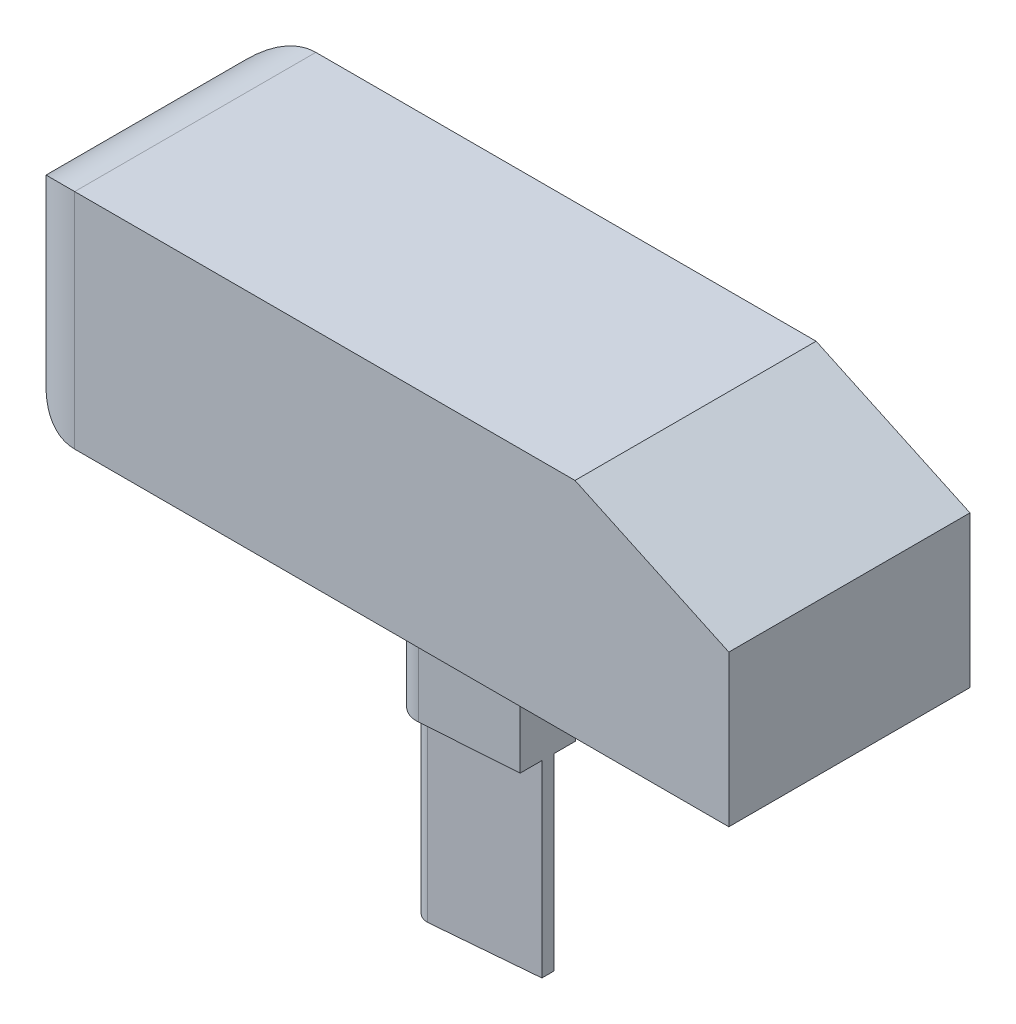
ISO-10303-21;
HEADER;
FILE_DESCRIPTION(('STEP AP214'),'2;1');
FILE_NAME('part.step','',(''),(''),'','','');
FILE_SCHEMA(('AUTOMOTIVE_DESIGN { 1 0 10303 214 1 1 1 1 }'));
ENDSEC;
DATA;
#1=APPLICATION_CONTEXT('core data for automotive mechanical design processes');
#2=APPLICATION_PROTOCOL_DEFINITION('international standard','automotive_design',2000,#1);
#3=PRODUCT_CONTEXT('',#1,'mechanical');
#4=PRODUCT('Part','Part','',(#3));
#5=PRODUCT_RELATED_PRODUCT_CATEGORY('part','',(#4));
#6=PRODUCT_DEFINITION_FORMATION('','',#4);
#7=PRODUCT_DEFINITION_CONTEXT('part definition',#1,'design');
#8=PRODUCT_DEFINITION('design','',#6,#7);
#9=PRODUCT_DEFINITION_SHAPE('','',#8);
#10=(LENGTH_UNIT() NAMED_UNIT(*) SI_UNIT(.MILLI.,.METRE.));
#11=(NAMED_UNIT(*) PLANE_ANGLE_UNIT() SI_UNIT($,.RADIAN.));
#12=(NAMED_UNIT(*) SI_UNIT($,.STERADIAN.) SOLID_ANGLE_UNIT());
#13=UNCERTAINTY_MEASURE_WITH_UNIT(LENGTH_MEASURE(1.E-05),#10,'distance_accuracy_value','');
#14=(GEOMETRIC_REPRESENTATION_CONTEXT(3) GLOBAL_UNCERTAINTY_ASSIGNED_CONTEXT((#13)) GLOBAL_UNIT_ASSIGNED_CONTEXT((#10,
#11,#12)) REPRESENTATION_CONTEXT('',''));
#15=CARTESIAN_POINT('',(0.,0.,0.));
#16=DIRECTION('',(0.,0.,1.));
#17=DIRECTION('',(1.,0.,0.));
#18=AXIS2_PLACEMENT_3D('',#15,#16,#17);
#19=CARTESIAN_POINT('',(-7.5,0.,0.));
#20=DIRECTION('',(0.,-1.,0.));
#21=DIRECTION('',(-1.,0.,0.));
#22=AXIS2_PLACEMENT_3D('',#19,#20,#21);
#23=CYLINDRICAL_SURFACE('',#22,2.5);
#24=DIRECTION('',(0.,1.,0.));
#25=VECTOR('',#24,1.);
#26=CARTESIAN_POINT('',(-10.,0.,0.));
#27=LINE('',#26,#25);
#28=CARTESIAN_POINT('',(-9.99999999999998,31.2499999999999,0.));
#29=VERTEX_POINT('',#28);
#30=CARTESIAN_POINT('',(-10.,0.,0.));
#31=VERTEX_POINT('',#30);
#32=EDGE_CURVE('E62',#29,#31,#27,.F.);
#33=ORIENTED_EDGE('',*,*,#32,.F.);
#34=CARTESIAN_POINT('',(-7.49999999999999,31.2499999999999,0.));
#35=DIRECTION('',(0.,1.,0.));
#36=DIRECTION('',(0.,0.,1.));
#37=AXIS2_PLACEMENT_3D('',#34,#35,#36);
#38=CIRCLE('',#37,2.5);
#39=CARTESIAN_POINT('',(-7.49999999999987,31.2499999999999,-2.49999999999999));
#40=VERTEX_POINT('',#39);
#41=EDGE_CURVE('E326',#29,#40,#38,.F.);
#42=ORIENTED_EDGE('',*,*,#41,.T.);
#43=DIRECTION('',(0.,1.,0.));
#44=VECTOR('',#43,1.);
#45=CARTESIAN_POINT('',(-7.49999999999998,49.25,-2.5));
#46=LINE('',#45,#44);
#47=CARTESIAN_POINT('',(-7.50000000000002,0.,-2.5));
#48=VERTEX_POINT('',#47);
#49=EDGE_CURVE('E46',#48,#40,#46,.T.);
#50=ORIENTED_EDGE('',*,*,#49,.F.);
#51=CARTESIAN_POINT('',(-7.5,0.,0.));
#52=DIRECTION('',(0.,1.,0.));
#53=DIRECTION('',(1.,0.,0.));
#54=AXIS2_PLACEMENT_3D('',#51,#52,#53);
#55=CIRCLE('',#54,2.5);
#56=EDGE_CURVE('E342',#31,#48,#55,.F.);
#57=ORIENTED_EDGE('',*,*,#56,.F.);
#58=EDGE_LOOP('',(#33,#42,#50,#57));
#59=FACE_BOUND('',#58,.T.);
#60=ADVANCED_FACE('F39',(#59),#23,.T.);
#61=CARTESIAN_POINT('',(-7.5,0.,0.));
#62=DIRECTION('',(0.,1.,0.));
#63=DIRECTION('',(1.,0.,0.));
#64=AXIS2_PLACEMENT_3D('',#61,#62,#63);
#65=CYLINDRICAL_SURFACE('',#64,2.5);
#66=DIRECTION('',(0.,1.,0.));
#67=VECTOR('',#66,1.);
#68=CARTESIAN_POINT('',(-7.5,0.,2.5));
#69=LINE('',#68,#67);
#70=CARTESIAN_POINT('',(-7.49999999999999,31.2499999999999,2.50000000000001));
#71=VERTEX_POINT('',#70);
#72=CARTESIAN_POINT('',(-7.50000000000002,0.,2.5));
#73=VERTEX_POINT('',#72);
#74=EDGE_CURVE('E345',#71,#73,#69,.F.);
#75=ORIENTED_EDGE('',*,*,#74,.F.);
#76=CARTESIAN_POINT('',(-7.49999999999999,31.2499999999999,0.));
#77=DIRECTION('',(0.,1.,0.));
#78=DIRECTION('',(0.,0.,1.));
#79=AXIS2_PLACEMENT_3D('',#76,#77,#78);
#80=CIRCLE('',#79,2.5);
#81=EDGE_CURVE('E318',#71,#29,#80,.F.);
#82=ORIENTED_EDGE('',*,*,#81,.T.);
#83=ORIENTED_EDGE('',*,*,#32,.T.);
#84=CARTESIAN_POINT('',(-7.5,0.,0.));
#85=DIRECTION('',(0.,1.,0.));
#86=DIRECTION('',(1.,0.,0.));
#87=AXIS2_PLACEMENT_3D('',#84,#85,#86);
#88=CIRCLE('',#87,2.5);
#89=EDGE_CURVE('E346',#73,#31,#88,.F.);
#90=ORIENTED_EDGE('',*,*,#89,.F.);
#91=EDGE_LOOP('',(#75,#82,#83,#90));
#92=FACE_BOUND('',#91,.T.);
#93=ADVANCED_FACE('F368',(#92),#65,.T.);
#94=CARTESIAN_POINT('',(0.1580226904376,0.,-1.84359805510535));
#95=DIRECTION('',(0.0854011413464352,0.,-0.996346649041751));
#96=DIRECTION('',(-0.996346649041751,0.,-0.0854011413464352));
#97=AXIS2_PLACEMENT_3D('',#94,#95,#96);
#98=PLANE('',#97);
#99=ORIENTED_EDGE('',*,*,#49,.T.);
#100=DIRECTION('',(0.996346649041751,0.,0.0854011413464352));
#101=VECTOR('',#100,1.);
#102=CARTESIAN_POINT('',(0.158022690437602,31.2499999999999,-1.84359805510535));
#103=LINE('',#102,#101);
#104=CARTESIAN_POINT('',(10.,31.2499999999999,-1.00000000000001));
#105=VERTEX_POINT('',#104);
#106=EDGE_CURVE('E328',#40,#105,#103,.T.);
#107=ORIENTED_EDGE('',*,*,#106,.T.);
#108=DIRECTION('',(0.,1.,0.));
#109=VECTOR('',#108,1.);
#110=CARTESIAN_POINT('',(9.99999999999998,0.,-1.00000000000001));
#111=LINE('',#110,#109);
#112=CARTESIAN_POINT('',(9.99999999999998,0.,-1.00000000000001));
#113=VERTEX_POINT('',#112);
#114=EDGE_CURVE('E188',#113,#105,#111,.T.);
#115=ORIENTED_EDGE('',*,*,#114,.F.);
#116=DIRECTION('',(-0.996346649041751,0.,-0.0854011413464352));
#117=VECTOR('',#116,1.);
#118=CARTESIAN_POINT('',(0.1580226904376,0.,-1.84359805510535));
#119=LINE('',#118,#117);
#120=EDGE_CURVE('E332',#113,#48,#119,.T.);
#121=ORIENTED_EDGE('',*,*,#120,.T.);
#122=EDGE_LOOP('',(#99,#107,#115,#121));
#123=FACE_BOUND('',#122,.T.);
#124=ADVANCED_FACE('F354',(#123),#98,.T.);
#125=CARTESIAN_POINT('',(0.158022690437602,0.,1.84359805510534));
#126=DIRECTION('',(0.0854011413464362,0.,0.996346649041751));
#127=DIRECTION('',(0.996346649041751,0.,-0.0854011413464362));
#128=AXIS2_PLACEMENT_3D('',#125,#126,#127);
#129=PLANE('',#128);
#130=DIRECTION('',(0.,1.,0.));
#131=VECTOR('',#130,1.);
#132=CARTESIAN_POINT('',(9.99999999999998,0.,0.999999999999992));
#133=LINE('',#132,#131);
#134=CARTESIAN_POINT('',(10.,0.,0.999999999999992));
#135=VERTEX_POINT('',#134);
#136=CARTESIAN_POINT('',(10.,31.2499999999999,0.999999999999989));
#137=VERTEX_POINT('',#136);
#138=EDGE_CURVE('E334',#135,#137,#133,.T.);
#139=ORIENTED_EDGE('',*,*,#138,.T.);
#140=DIRECTION('',(-0.996346649041751,0.,0.0854011413464362));
#141=VECTOR('',#140,1.);
#142=CARTESIAN_POINT('',(0.158022690437601,31.2499999999999,1.84359805510535));
#143=LINE('',#142,#141);
#144=EDGE_CURVE('E11',#137,#71,#143,.T.);
#145=ORIENTED_EDGE('',*,*,#144,.T.);
#146=ORIENTED_EDGE('',*,*,#74,.T.);
#147=DIRECTION('',(0.996346649041751,0.,-0.0854011413464362));
#148=VECTOR('',#147,1.);
#149=CARTESIAN_POINT('',(0.158022690437602,0.,1.84359805510534));
#150=LINE('',#149,#148);
#151=EDGE_CURVE('E52',#73,#135,#150,.T.);
#152=ORIENTED_EDGE('',*,*,#151,.T.);
#153=EDGE_LOOP('',(#139,#145,#146,#152));
#154=FACE_BOUND('',#153,.T.);
#155=ADVANCED_FACE('F370',(#154),#129,.T.);
#156=CARTESIAN_POINT('',(10.,0.,-2.5));
#157=DIRECTION('',(0.,1.,0.));
#158=DIRECTION('',(1.,0.,0.));
#159=AXIS2_PLACEMENT_3D('',#156,#157,#158);
#160=PLANE('',#159);
#161=ORIENTED_EDGE('',*,*,#151,.F.);
#162=ORIENTED_EDGE('',*,*,#89,.T.);
#163=ORIENTED_EDGE('',*,*,#56,.T.);
#164=ORIENTED_EDGE('',*,*,#120,.F.);
#165=DIRECTION('',(0.,0.,1.));
#166=VECTOR('',#165,1.);
#167=CARTESIAN_POINT('',(10.,0.,-2.5));
#168=LINE('',#167,#166);
#169=EDGE_CURVE('E340',#113,#135,#168,.T.);
#170=ORIENTED_EDGE('',*,*,#169,.T.);
#171=EDGE_LOOP('',(#161,#162,#163,#164,#170));
#172=FACE_BOUND('',#171,.T.);
#173=ADVANCED_FACE('F369',(#172),#160,.F.);
#174=CARTESIAN_POINT('',(10.,0.,-2.5));
#175=DIRECTION('',(-1.,0.,0.));
#176=DIRECTION('',(0.,1.,0.));
#177=AXIS2_PLACEMENT_3D('',#174,#175,#176);
#178=PLANE('',#177);
#179=DIRECTION('',(0.,0.,1.));
#180=VECTOR('',#179,1.);
#181=CARTESIAN_POINT('',(10.,56.2499999999999,-5.99999999999999));
#182=LINE('',#181,#180);
#183=CARTESIAN_POINT('',(10.,56.2499999999999,-4.60146376112992));
#184=VERTEX_POINT('',#183);
#185=CARTESIAN_POINT('',(10.,56.2499999999999,-2.49999999999999));
#186=VERTEX_POINT('',#185);
#187=EDGE_CURVE('E228',#184,#186,#182,.T.);
#188=ORIENTED_EDGE('',*,*,#187,.T.);
#189=DIRECTION('',(0.,1.,0.));
#190=VECTOR('',#189,1.);
#191=CARTESIAN_POINT('',(10.,31.2499999999999,-2.49999999999999));
#192=LINE('',#191,#190);
#193=CARTESIAN_POINT('',(10.,49.25,-2.49999999999999));
#194=VERTEX_POINT('',#193);
#195=EDGE_CURVE('E219',#194,#186,#192,.T.);
#196=ORIENTED_EDGE('',*,*,#195,.F.);
#197=DIRECTION('',(0.,0.,1.));
#198=VECTOR('',#197,1.);
#199=CARTESIAN_POINT('',(10.,49.25,-2.5));
#200=LINE('',#199,#198);
#201=CARTESIAN_POINT('',(10.,49.25,2.50000000000002));
#202=VERTEX_POINT('',#201);
#203=EDGE_CURVE('E338',#194,#202,#200,.T.);
#204=ORIENTED_EDGE('',*,*,#203,.T.);
#205=DIRECTION('',(0.,-1.,0.));
#206=VECTOR('',#205,1.);
#207=CARTESIAN_POINT('',(10.,31.2499999999999,2.50000000000001));
#208=LINE('',#207,#206);
#209=CARTESIAN_POINT('',(10.,56.2499999999999,2.50000000000003));
#210=VERTEX_POINT('',#209);
#211=EDGE_CURVE('E225',#210,#202,#208,.T.);
#212=ORIENTED_EDGE('',*,*,#211,.F.);
#213=CARTESIAN_POINT('',(10.,56.2499999999999,4.60146376112995));
#214=VERTEX_POINT('',#213);
#215=EDGE_CURVE('E230',#210,#214,#182,.T.);
#216=ORIENTED_EDGE('',*,*,#215,.T.);
#217=DIRECTION('',(0.,-1.,0.));
#218=VECTOR('',#217,1.);
#219=CARTESIAN_POINT('',(10.,31.2499999999999,4.60146376112995));
#220=LINE('',#219,#218);
#221=CARTESIAN_POINT('',(10.,31.2499999999999,4.60146376112995));
#222=VERTEX_POINT('',#221);
#223=EDGE_CURVE('E202',#214,#222,#220,.T.);
#224=ORIENTED_EDGE('',*,*,#223,.T.);
#225=DIRECTION('',(0.,0.,1.));
#226=VECTOR('',#225,1.);
#227=CARTESIAN_POINT('',(10.,31.2499999999999,-29.4072480941475));
#228=LINE('',#227,#226);
#229=EDGE_CURVE('E192',#137,#222,#228,.T.);
#230=ORIENTED_EDGE('',*,*,#229,.F.);
#231=ORIENTED_EDGE('',*,*,#138,.F.);
#232=ORIENTED_EDGE('',*,*,#169,.F.);
#233=ORIENTED_EDGE('',*,*,#114,.T.);
#234=CARTESIAN_POINT('',(10.,31.2499999999999,-4.60146376112992));
#235=VERTEX_POINT('',#234);
#236=EDGE_CURVE('E181',#235,#105,#228,.T.);
#237=ORIENTED_EDGE('',*,*,#236,.F.);
#238=DIRECTION('',(0.,1.,0.));
#239=VECTOR('',#238,1.);
#240=CARTESIAN_POINT('',(10.,31.2499999999999,-4.60146376112992));
#241=LINE('',#240,#239);
#242=EDGE_CURVE('E190',#235,#184,#241,.T.);
#243=ORIENTED_EDGE('',*,*,#242,.T.);
#244=EDGE_LOOP('',(#188,#196,#204,#212,#216,#224,#230,#231,#232,#233,#237,#243));
#245=FACE_BOUND('',#244,.T.);
#246=ADVANCED_FACE('F187',(#245),#178,.F.);
#247=CARTESIAN_POINT('',(10.,49.25,-2.5));
#248=DIRECTION('',(0.,-1.,0.));
#249=DIRECTION('',(0.,0.,1.));
#250=AXIS2_PLACEMENT_3D('',#247,#248,#249);
#251=PLANE('',#250);
#252=DIRECTION('',(1.,0.,0.));
#253=VECTOR('',#252,1.);
#254=CARTESIAN_POINT('',(10.,49.25,-2.49999999999999));
#255=LINE('',#254,#253);
#256=CARTESIAN_POINT('',(-9.99999999999998,49.25,-2.49999999999999));
#257=VERTEX_POINT('',#256);
#258=EDGE_CURVE('E310',#257,#194,#255,.T.);
#259=ORIENTED_EDGE('',*,*,#258,.F.);
#260=DIRECTION('',(0.,0.,1.));
#261=VECTOR('',#260,1.);
#262=CARTESIAN_POINT('',(-9.99999999999999,49.25,-29.4072480941475));
#263=LINE('',#262,#261);
#264=CARTESIAN_POINT('',(-9.99999999999998,49.25,2.50000000000002));
#265=VERTEX_POINT('',#264);
#266=EDGE_CURVE('E309',#257,#265,#263,.T.);
#267=ORIENTED_EDGE('',*,*,#266,.T.);
#268=DIRECTION('',(1.,0.,0.));
#269=VECTOR('',#268,1.);
#270=CARTESIAN_POINT('',(10.,49.25,2.50000000000002));
#271=LINE('',#270,#269);
#272=EDGE_CURVE('E308',#265,#202,#271,.T.);
#273=ORIENTED_EDGE('',*,*,#272,.T.);
#274=ORIENTED_EDGE('',*,*,#203,.F.);
#275=EDGE_LOOP('',(#259,#267,#273,#274));
#276=FACE_BOUND('',#275,.T.);
#277=ADVANCED_FACE('F383',(#276),#251,.F.);
#278=CARTESIAN_POINT('',(-9.99999999999999,49.25,-29.4072480941475));
#279=DIRECTION('',(1.,0.,0.));
#280=DIRECTION('',(0.,0.,-1.));
#281=AXIS2_PLACEMENT_3D('',#278,#279,#280);
#282=PLANE('',#281);
#283=ORIENTED_EDGE('',*,*,#266,.F.);
#284=DIRECTION('',(0.,1.,0.));
#285=VECTOR('',#284,1.);
#286=CARTESIAN_POINT('',(-9.99999999999998,49.25,-2.49999999999998));
#287=LINE('',#286,#285);
#288=CARTESIAN_POINT('',(-9.99999999999998,31.2499999999999,-2.49999999999998));
#289=VERTEX_POINT('',#288);
#290=EDGE_CURVE('E312',#289,#257,#287,.T.);
#291=ORIENTED_EDGE('',*,*,#290,.F.);
#292=DIRECTION('',(0.,0.,1.));
#293=VECTOR('',#292,1.);
#294=CARTESIAN_POINT('',(-9.99999999999999,31.2499999999999,-29.4072480941475));
#295=LINE('',#294,#293);
#296=EDGE_CURVE('E314',#289,#29,#295,.T.);
#297=ORIENTED_EDGE('',*,*,#296,.T.);
#298=CARTESIAN_POINT('',(-9.99999999999998,31.2499999999999,2.50000000000002));
#299=VERTEX_POINT('',#298);
#300=EDGE_CURVE('E193',#29,#299,#295,.T.);
#301=ORIENTED_EDGE('',*,*,#300,.T.);
#302=DIRECTION('',(0.,1.,0.));
#303=VECTOR('',#302,1.);
#304=CARTESIAN_POINT('',(-9.99999999999998,49.25,2.50000000000002));
#305=LINE('',#304,#303);
#306=EDGE_CURVE('E313',#299,#265,#305,.T.);
#307=ORIENTED_EDGE('',*,*,#306,.T.);
#308=EDGE_LOOP('',(#283,#291,#297,#301,#307));
#309=FACE_BOUND('',#308,.T.);
#310=ADVANCED_FACE('F365',(#309),#282,.F.);
#311=CARTESIAN_POINT('',(-9.99999999999999,31.2499999999999,-29.4072480941475));
#312=DIRECTION('',(0.,1.,0.));
#313=DIRECTION('',(0.,0.,1.));
#314=AXIS2_PLACEMENT_3D('',#311,#312,#313);
#315=PLANE('',#314);
#316=ORIENTED_EDGE('',*,*,#106,.F.);
#317=ORIENTED_EDGE('',*,*,#41,.F.);
#318=ORIENTED_EDGE('',*,*,#296,.F.);
#319=CARTESIAN_POINT('',(-6.07759419707998,31.2499999999999,-1.71595107472841));
#320=DIRECTION('',(0.,-1.,0.));
#321=DIRECTION('',(0.,0.,-1.));
#322=AXIS2_PLACEMENT_3D('',#319,#320,#321);
#323=CIRCLE('',#322,4.);
#324=CARTESIAN_POINT('',(-5.79856830210351,31.2499999999999,-5.70620727576771));
#325=VERTEX_POINT('',#324);
#326=EDGE_CURVE('E209',#289,#325,#323,.T.);
#327=ORIENTED_EDGE('',*,*,#326,.T.);
#328=DIRECTION('',(-0.997564050259825,0.,-0.0697564737441185));
#329=VECTOR('',#328,1.);
#330=CARTESIAN_POINT('',(25.,31.2499999999999,-3.55256158197736));
#331=LINE('',#330,#329);
#332=EDGE_CURVE('E199',#235,#325,#331,.T.);
#333=ORIENTED_EDGE('',*,*,#332,.F.);
#334=ORIENTED_EDGE('',*,*,#236,.T.);
#335=EDGE_LOOP('',(#316,#317,#318,#327,#333,#334));
#336=FACE_BOUND('',#335,.T.);
#337=ADVANCED_FACE('F210',(#336),#315,.F.);
#338=ORIENTED_EDGE('',*,*,#81,.F.);
#339=ORIENTED_EDGE('',*,*,#144,.F.);
#340=ORIENTED_EDGE('',*,*,#229,.T.);
#341=DIRECTION('',(0.997564050259825,0.,-0.0697564737441182));
#342=VECTOR('',#341,1.);
#343=CARTESIAN_POINT('',(-9.99999999999998,31.2499999999999,6.00000000000001));
#344=LINE('',#343,#342);
#345=CARTESIAN_POINT('',(-5.79856830210351,31.2499999999999,5.70620727576773));
#346=VERTEX_POINT('',#345);
#347=EDGE_CURVE('E215',#346,#222,#344,.T.);
#348=ORIENTED_EDGE('',*,*,#347,.F.);
#349=CARTESIAN_POINT('',(-6.07759419707998,31.2499999999999,1.71595107472843));
#350=DIRECTION('',(0.,-1.,0.));
#351=DIRECTION('',(0.,0.,-1.));
#352=AXIS2_PLACEMENT_3D('',#349,#350,#351);
#353=CIRCLE('',#352,4.);
#354=EDGE_CURVE('E299',#346,#299,#353,.T.);
#355=ORIENTED_EDGE('',*,*,#354,.T.);
#356=ORIENTED_EDGE('',*,*,#300,.F.);
#357=EDGE_LOOP('',(#338,#339,#340,#348,#355,#356));
#358=FACE_BOUND('',#357,.T.);
#359=ADVANCED_FACE('F357',(#358),#315,.F.);
#360=CARTESIAN_POINT('',(-20.,31.2499999999999,-2.49999999999998));
#361=DIRECTION('',(0.,0.,-1.));
#362=DIRECTION('',(-1.,0.,0.));
#363=AXIS2_PLACEMENT_3D('',#360,#361,#362);
#364=PLANE('',#363);
#365=DIRECTION('',(0.,1.,0.));
#366=VECTOR('',#365,1.);
#367=CARTESIAN_POINT('',(-9.99999999999998,31.2499999999999,-2.49999999999998));
#368=LINE('',#367,#366);
#369=CARTESIAN_POINT('',(-9.99999999999998,56.2499999999999,-2.49999999999998));
#370=VERTEX_POINT('',#369);
#371=EDGE_CURVE('E292',#257,#370,#368,.T.);
#372=ORIENTED_EDGE('',*,*,#371,.F.);
#373=ORIENTED_EDGE('',*,*,#258,.T.);
#374=ORIENTED_EDGE('',*,*,#195,.T.);
#375=DIRECTION('',(1.,0.,0.));
#376=VECTOR('',#375,1.);
#377=CARTESIAN_POINT('',(-20.,56.2499999999999,-2.49999999999998));
#378=LINE('',#377,#376);
#379=EDGE_CURVE('E221',#370,#186,#378,.T.);
#380=ORIENTED_EDGE('',*,*,#379,.F.);
#381=EDGE_LOOP('',(#372,#373,#374,#380));
#382=FACE_BOUND('',#381,.T.);
#383=ADVANCED_FACE('F389',(#382),#364,.F.);
#384=CARTESIAN_POINT('',(0.,56.2499999999999,0.));
#385=DIRECTION('',(0.,1.,0.));
#386=DIRECTION('',(0.,0.,1.));
#387=AXIS2_PLACEMENT_3D('',#384,#385,#386);
#388=PLANE('',#387);
#389=ORIENTED_EDGE('',*,*,#187,.F.);
#390=DIRECTION('',(-0.997564050259825,0.,-0.0697564737441185));
#391=VECTOR('',#390,1.);
#392=CARTESIAN_POINT('',(25.,56.2499999999999,-3.55256158197736));
#393=LINE('',#392,#391);
#394=CARTESIAN_POINT('',(-5.79856830210352,56.2499999999999,-5.70620727576771));
#395=VERTEX_POINT('',#394);
#396=EDGE_CURVE('E201',#184,#395,#393,.T.);
#397=ORIENTED_EDGE('',*,*,#396,.T.);
#398=CARTESIAN_POINT('',(-6.07759419707998,56.2499999999999,-1.71595107472841));
#399=DIRECTION('',(0.,1.,0.));
#400=DIRECTION('',(0.,0.,1.));
#401=AXIS2_PLACEMENT_3D('',#398,#399,#400);
#402=CIRCLE('',#401,4.);
#403=EDGE_CURVE('E304',#395,#370,#402,.T.);
#404=ORIENTED_EDGE('',*,*,#403,.T.);
#405=ORIENTED_EDGE('',*,*,#379,.T.);
#406=EDGE_LOOP('',(#389,#397,#404,#405));
#407=FACE_BOUND('',#406,.T.);
#408=DIRECTION('',(1.,0.,0.));
#409=VECTOR('',#408,1.);
#410=CARTESIAN_POINT('',(-20.,56.2499999999999,2.50000000000003));
#411=LINE('',#410,#409);
#412=CARTESIAN_POINT('',(-9.99999999999998,56.2499999999999,2.50000000000003));
#413=VERTEX_POINT('',#412);
#414=EDGE_CURVE('E223',#413,#210,#411,.T.);
#415=ORIENTED_EDGE('',*,*,#414,.F.);
#416=CARTESIAN_POINT('',(-6.07759419707998,56.2499999999999,1.71595107472845));
#417=DIRECTION('',(0.,1.,0.));
#418=DIRECTION('',(0.,0.,1.));
#419=AXIS2_PLACEMENT_3D('',#416,#417,#418);
#420=CIRCLE('',#419,4.);
#421=CARTESIAN_POINT('',(-5.79856830210351,56.2499999999999,5.70620727576773));
#422=VERTEX_POINT('',#421);
#423=EDGE_CURVE('E303',#413,#422,#420,.T.);
#424=ORIENTED_EDGE('',*,*,#423,.T.);
#425=DIRECTION('',(0.997564050259825,0.,-0.0697564737441182));
#426=VECTOR('',#425,1.);
#427=CARTESIAN_POINT('',(-9.99999999999998,56.2499999999999,6.00000000000001));
#428=LINE('',#427,#426);
#429=EDGE_CURVE('E211',#422,#214,#428,.T.);
#430=ORIENTED_EDGE('',*,*,#429,.T.);
#431=ORIENTED_EDGE('',*,*,#215,.F.);
#432=EDGE_LOOP('',(#415,#424,#430,#431));
#433=FACE_BOUND('',#432,.T.);
#434=DIRECTION('',(1.,0.,0.));
#435=VECTOR('',#434,1.);
#436=CARTESIAN_POINT('',(-60.03,56.2499999999999,20.01));
#437=LINE('',#436,#435);
#438=CARTESIAN_POINT('',(-48.53,56.2499999999999,20.01));
#439=VERTEX_POINT('',#438);
#440=CARTESIAN_POINT('',(60.03,56.2499999999999,20.01));
#441=VERTEX_POINT('',#440);
#442=EDGE_CURVE('E239',#439,#441,#437,.T.);
#443=ORIENTED_EDGE('',*,*,#442,.F.);
#444=DIRECTION('',(0.,0.,1.));
#445=VECTOR('',#444,1.);
#446=CARTESIAN_POINT('',(-48.53,56.2499999999999,0.));
#447=LINE('',#446,#445);
#448=CARTESIAN_POINT('',(-48.53,56.2499999999999,-20.01));
#449=VERTEX_POINT('',#448);
#450=EDGE_CURVE('E271',#439,#449,#447,.F.);
#451=ORIENTED_EDGE('',*,*,#450,.T.);
#452=DIRECTION('',(1.,0.,0.));
#453=VECTOR('',#452,1.);
#454=CARTESIAN_POINT('',(-60.03,56.2499999999999,-20.01));
#455=LINE('',#454,#453);
#456=CARTESIAN_POINT('',(60.03,56.2499999999999,-20.01));
#457=VERTEX_POINT('',#456);
#458=EDGE_CURVE('E237',#449,#457,#455,.T.);
#459=ORIENTED_EDGE('',*,*,#458,.T.);
#460=DIRECTION('',(0.,0.,1.));
#461=VECTOR('',#460,1.);
#462=CARTESIAN_POINT('',(60.03,56.2499999999999,-20.01));
#463=LINE('',#462,#461);
#464=EDGE_CURVE('E242',#457,#441,#463,.T.);
#465=ORIENTED_EDGE('',*,*,#464,.T.);
#466=EDGE_LOOP('',(#443,#451,#459,#465));
#467=FACE_BOUND('',#466,.T.);
#468=ADVANCED_FACE('F394',(#407,#433,#467),#388,.F.);
#469=CARTESIAN_POINT('',(-60.03,93.2684999999999,-20.01));
#470=DIRECTION('',(1.,0.,0.));
#471=DIRECTION('',(0.,0.,-1.));
#472=AXIS2_PLACEMENT_3D('',#469,#470,#471);
#473=PLANE('',#472);
#474=DIRECTION('',(0.,-1.,0.));
#475=VECTOR('',#474,1.);
#476=CARTESIAN_POINT('',(-60.03,56.2499999999999,-8.51000000000001));
#477=LINE('',#476,#475);
#478=CARTESIAN_POINT('',(-60.03,81.7684999999999,-8.51000000000001));
#479=VERTEX_POINT('',#478);
#480=CARTESIAN_POINT('',(-60.03,67.7499999999999,-8.51000000000001));
#481=VERTEX_POINT('',#480);
#482=EDGE_CURVE('E266',#479,#481,#477,.T.);
#483=ORIENTED_EDGE('',*,*,#482,.T.);
#484=DIRECTION('',(0.,0.,1.));
#485=VECTOR('',#484,1.);
#486=CARTESIAN_POINT('',(-60.03,67.7499999999999,-20.01));
#487=LINE('',#486,#485);
#488=CARTESIAN_POINT('',(-60.03,67.7499999999999,8.50999999999998));
#489=VERTEX_POINT('',#488);
#490=EDGE_CURVE('E268',#481,#489,#487,.T.);
#491=ORIENTED_EDGE('',*,*,#490,.T.);
#492=DIRECTION('',(0.,-1.,0.));
#493=VECTOR('',#492,1.);
#494=CARTESIAN_POINT('',(-60.03,93.2684999999999,8.50999999999998));
#495=LINE('',#494,#493);
#496=CARTESIAN_POINT('',(-60.03,81.7684999999999,8.50999999999998));
#497=VERTEX_POINT('',#496);
#498=EDGE_CURVE('E265',#489,#497,#495,.F.);
#499=ORIENTED_EDGE('',*,*,#498,.T.);
#500=DIRECTION('',(0.,0.,1.));
#501=VECTOR('',#500,1.);
#502=CARTESIAN_POINT('',(-60.03,81.7684999999999,-20.01));
#503=LINE('',#502,#501);
#504=EDGE_CURVE('E262',#497,#479,#503,.F.);
#505=ORIENTED_EDGE('',*,*,#504,.T.);
#506=EDGE_LOOP('',(#483,#491,#499,#505));
#507=FACE_BOUND('',#506,.T.);
#508=ADVANCED_FACE('F405',(#507),#473,.F.);
#509=CARTESIAN_POINT('',(-60.03,93.2684999999999,20.01));
#510=DIRECTION('',(0.,0.,-1.));
#511=DIRECTION('',(-1.,0.,0.));
#512=AXIS2_PLACEMENT_3D('',#509,#510,#511);
#513=PLANE('',#512);
#514=DIRECTION('',(1.,0.,0.));
#515=VECTOR('',#514,1.);
#516=CARTESIAN_POINT('',(-60.03,93.2684999999999,20.01));
#517=LINE('',#516,#515);
#518=CARTESIAN_POINT('',(-48.53,93.2684999999999,20.01));
#519=VERTEX_POINT('',#518);
#520=CARTESIAN_POINT('',(34.4999999999998,93.2684999999999,20.01));
#521=VERTEX_POINT('',#520);
#522=EDGE_CURVE('E235',#519,#521,#517,.T.);
#523=ORIENTED_EDGE('',*,*,#522,.F.);
#524=DIRECTION('',(0.,-1.,0.));
#525=VECTOR('',#524,1.);
#526=CARTESIAN_POINT('',(-48.53,93.2684999999999,20.01));
#527=LINE('',#526,#525);
#528=EDGE_CURVE('E279',#519,#439,#527,.T.);
#529=ORIENTED_EDGE('',*,*,#528,.T.);
#530=ORIENTED_EDGE('',*,*,#442,.T.);
#531=DIRECTION('',(0.,-1.,0.));
#532=VECTOR('',#531,1.);
#533=CARTESIAN_POINT('',(60.03,93.2684999999999,20.01));
#534=LINE('',#533,#532);
#535=CARTESIAN_POINT('',(60.03,81.3636654873027,20.01));
#536=VERTEX_POINT('',#535);
#537=EDGE_CURVE('E250',#536,#441,#534,.T.);
#538=ORIENTED_EDGE('',*,*,#537,.F.);
#539=DIRECTION('',(0.906307787036651,-0.422618261740697,0.));
#540=VECTOR('',#539,1.);
#541=CARTESIAN_POINT('',(60.03,81.3636654873027,20.01));
#542=LINE('',#541,#540);
#543=EDGE_CURVE('E255',#536,#521,#542,.F.);
#544=ORIENTED_EDGE('',*,*,#543,.T.);
#545=EDGE_LOOP('',(#523,#529,#530,#538,#544));
#546=FACE_BOUND('',#545,.T.);
#547=ADVANCED_FACE('F492',(#546),#513,.F.);
#548=CARTESIAN_POINT('',(60.03,93.2684999999999,-20.01));
#549=DIRECTION('',(1.,0.,0.));
#550=DIRECTION('',(0.,0.,-1.));
#551=AXIS2_PLACEMENT_3D('',#548,#549,#550);
#552=PLANE('',#551);
#553=DIRECTION('',(0.,-1.,0.));
#554=VECTOR('',#553,1.);
#555=CARTESIAN_POINT('',(60.03,93.2684999999999,-20.01));
#556=LINE('',#555,#554);
#557=CARTESIAN_POINT('',(60.03,81.3636654873027,-20.01));
#558=VERTEX_POINT('',#557);
#559=EDGE_CURVE('E236',#558,#457,#556,.T.);
#560=ORIENTED_EDGE('',*,*,#559,.F.);
#561=DIRECTION('',(0.,0.,1.));
#562=VECTOR('',#561,1.);
#563=CARTESIAN_POINT('',(60.03,81.3636654873027,-20.01));
#564=LINE('',#563,#562);
#565=EDGE_CURVE('E253',#558,#536,#564,.T.);
#566=ORIENTED_EDGE('',*,*,#565,.T.);
#567=ORIENTED_EDGE('',*,*,#537,.T.);
#568=ORIENTED_EDGE('',*,*,#464,.F.);
#569=EDGE_LOOP('',(#560,#566,#567,#568));
#570=FACE_BOUND('',#569,.T.);
#571=ADVANCED_FACE('F489',(#570),#552,.T.);
#572=CARTESIAN_POINT('',(-60.03,93.2684999999999,-20.01));
#573=DIRECTION('',(0.,0.,-1.));
#574=DIRECTION('',(-1.,0.,0.));
#575=AXIS2_PLACEMENT_3D('',#572,#573,#574);
#576=PLANE('',#575);
#577=ORIENTED_EDGE('',*,*,#458,.F.);
#578=DIRECTION('',(0.,-1.,0.));
#579=VECTOR('',#578,1.);
#580=CARTESIAN_POINT('',(-48.53,93.2684999999999,-20.01));
#581=LINE('',#580,#579);
#582=CARTESIAN_POINT('',(-48.53,93.2684999999999,-20.01));
#583=VERTEX_POINT('',#582);
#584=EDGE_CURVE('E273',#449,#583,#581,.F.);
#585=ORIENTED_EDGE('',*,*,#584,.T.);
#586=DIRECTION('',(1.,0.,0.));
#587=VECTOR('',#586,1.);
#588=CARTESIAN_POINT('',(-60.03,93.2684999999999,-20.01));
#589=LINE('',#588,#587);
#590=CARTESIAN_POINT('',(34.4999999999998,93.2684999999999,-20.01));
#591=VERTEX_POINT('',#590);
#592=EDGE_CURVE('E232',#583,#591,#589,.T.);
#593=ORIENTED_EDGE('',*,*,#592,.T.);
#594=DIRECTION('',(-0.906307787036651,0.422618261740697,0.));
#595=VECTOR('',#594,1.);
#596=CARTESIAN_POINT('',(-43.1463563718345,129.475590604018,-20.01));
#597=LINE('',#596,#595);
#598=EDGE_CURVE('E257',#591,#558,#597,.F.);
#599=ORIENTED_EDGE('',*,*,#598,.T.);
#600=ORIENTED_EDGE('',*,*,#559,.T.);
#601=EDGE_LOOP('',(#577,#585,#593,#599,#600));
#602=FACE_BOUND('',#601,.T.);
#603=ADVANCED_FACE('F427',(#602),#576,.T.);
#604=CARTESIAN_POINT('',(0.,93.2684999999999,0.));
#605=DIRECTION('',(0.,1.,0.));
#606=DIRECTION('',(0.,0.,1.));
#607=AXIS2_PLACEMENT_3D('',#604,#605,#606);
#608=PLANE('',#607);
#609=ORIENTED_EDGE('',*,*,#592,.F.);
#610=DIRECTION('',(0.,0.,1.));
#611=VECTOR('',#610,1.);
#612=CARTESIAN_POINT('',(-48.53,93.2684999999999,20.01));
#613=LINE('',#612,#611);
#614=EDGE_CURVE('E277',#583,#519,#613,.T.);
#615=ORIENTED_EDGE('',*,*,#614,.T.);
#616=ORIENTED_EDGE('',*,*,#522,.T.);
#617=DIRECTION('',(0.,0.,-1.));
#618=VECTOR('',#617,1.);
#619=CARTESIAN_POINT('',(34.4999999999998,93.2684999999999,0.));
#620=LINE('',#619,#618);
#621=EDGE_CURVE('E260',#521,#591,#620,.T.);
#622=ORIENTED_EDGE('',*,*,#621,.T.);
#623=EDGE_LOOP('',(#609,#615,#616,#622));
#624=FACE_BOUND('',#623,.T.);
#625=ADVANCED_FACE('F435',(#624),#608,.T.);
#626=CARTESIAN_POINT('',(60.03,81.3636654873027,-20.01));
#627=DIRECTION('',(-0.422618261740697,-0.906307787036651,0.));
#628=DIRECTION('',(0.,0.,1.));
#629=AXIS2_PLACEMENT_3D('',#626,#627,#628);
#630=PLANE('',#629);
#631=ORIENTED_EDGE('',*,*,#598,.F.);
#632=ORIENTED_EDGE('',*,*,#621,.F.);
#633=ORIENTED_EDGE('',*,*,#543,.F.);
#634=ORIENTED_EDGE('',*,*,#565,.F.);
#635=EDGE_LOOP('',(#631,#632,#633,#634));
#636=FACE_BOUND('',#635,.T.);
#637=ADVANCED_FACE('F438',(#636),#630,.F.);
#638=CARTESIAN_POINT('',(-48.53,81.7684999999999,0.));
#639=DIRECTION('',(0.,0.,-1.));
#640=DIRECTION('',(-1.,0.,0.));
#641=AXIS2_PLACEMENT_3D('',#638,#639,#640);
#642=CYLINDRICAL_SURFACE('',#641,11.5);
#643=CARTESIAN_POINT('',(-48.53,81.7684999999999,8.50999999999998));
#644=DIRECTION('',(0.,-0.707106781186547,0.707106781186547));
#645=DIRECTION('',(0.,-0.707106781186547,-0.707106781186547));
#646=AXIS2_PLACEMENT_3D('',#643,#644,#645);
#647=ELLIPSE('',#646,16.2634559672906,11.5);
#648=EDGE_CURVE('E281',#519,#497,#647,.T.);
#649=ORIENTED_EDGE('',*,*,#648,.F.);
#650=ORIENTED_EDGE('',*,*,#614,.F.);
#651=CARTESIAN_POINT('',(-48.53,81.7684999999999,-8.51000000000001));
#652=DIRECTION('',(0.,-0.707106781186547,-0.707106781186547));
#653=DIRECTION('',(0.,0.707106781186547,-0.707106781186547));
#654=AXIS2_PLACEMENT_3D('',#651,#652,#653);
#655=ELLIPSE('',#654,16.2634559672906,11.5);
#656=EDGE_CURVE('E245',#479,#583,#655,.T.);
#657=ORIENTED_EDGE('',*,*,#656,.F.);
#658=ORIENTED_EDGE('',*,*,#504,.F.);
#659=EDGE_LOOP('',(#649,#650,#657,#658));
#660=FACE_BOUND('',#659,.T.);
#661=ADVANCED_FACE('F440',(#660),#642,.T.);
#662=CARTESIAN_POINT('',(-48.53,93.2684999999999,-8.51000000000001));
#663=DIRECTION('',(0.,1.,0.));
#664=DIRECTION('',(0.,0.,1.));
#665=AXIS2_PLACEMENT_3D('',#662,#663,#664);
#666=CYLINDRICAL_SURFACE('',#665,11.5);
#667=ORIENTED_EDGE('',*,*,#656,.T.);
#668=ORIENTED_EDGE('',*,*,#584,.F.);
#669=CARTESIAN_POINT('',(-48.53,67.7499999999999,-8.51000000000001));
#670=DIRECTION('',(0.,0.707106781186547,-0.707106781186547));
#671=DIRECTION('',(0.,0.707106781186547,0.707106781186547));
#672=AXIS2_PLACEMENT_3D('',#669,#670,#671);
#673=ELLIPSE('',#672,16.2634559672906,11.5);
#674=EDGE_CURVE('E285',#481,#449,#673,.F.);
#675=ORIENTED_EDGE('',*,*,#674,.F.);
#676=ORIENTED_EDGE('',*,*,#482,.F.);
#677=EDGE_LOOP('',(#667,#668,#675,#676));
#678=FACE_BOUND('',#677,.T.);
#679=ADVANCED_FACE('F426',(#678),#666,.T.);
#680=CARTESIAN_POINT('',(-48.53,93.2684999999999,8.50999999999998));
#681=DIRECTION('',(0.,-1.,0.));
#682=DIRECTION('',(0.,0.,-1.));
#683=AXIS2_PLACEMENT_3D('',#680,#681,#682);
#684=CYLINDRICAL_SURFACE('',#683,11.5);
#685=ORIENTED_EDGE('',*,*,#648,.T.);
#686=ORIENTED_EDGE('',*,*,#498,.F.);
#687=CARTESIAN_POINT('',(-48.53,67.7499999999999,8.50999999999998));
#688=DIRECTION('',(0.,-0.707106781186547,-0.707106781186547));
#689=DIRECTION('',(0.,-0.707106781186547,0.707106781186547));
#690=AXIS2_PLACEMENT_3D('',#687,#688,#689);
#691=ELLIPSE('',#690,16.2634559672906,11.5);
#692=EDGE_CURVE('E231',#439,#489,#691,.T.);
#693=ORIENTED_EDGE('',*,*,#692,.F.);
#694=ORIENTED_EDGE('',*,*,#528,.F.);
#695=EDGE_LOOP('',(#685,#686,#693,#694));
#696=FACE_BOUND('',#695,.T.);
#697=ADVANCED_FACE('F420',(#696),#684,.T.);
#698=CARTESIAN_POINT('',(-48.53,67.7499999999999,-20.01));
#699=DIRECTION('',(0.,0.,1.));
#700=DIRECTION('',(1.,0.,0.));
#701=AXIS2_PLACEMENT_3D('',#698,#699,#700);
#702=CYLINDRICAL_SURFACE('',#701,11.5);
#703=ORIENTED_EDGE('',*,*,#674,.T.);
#704=ORIENTED_EDGE('',*,*,#450,.F.);
#705=ORIENTED_EDGE('',*,*,#692,.T.);
#706=ORIENTED_EDGE('',*,*,#490,.F.);
#707=EDGE_LOOP('',(#703,#704,#705,#706));
#708=FACE_BOUND('',#707,.T.);
#709=ADVANCED_FACE('F411',(#708),#702,.T.);
#710=CARTESIAN_POINT('',(-20.,31.2499999999999,2.50000000000001));
#711=DIRECTION('',(0.,0.,1.));
#712=DIRECTION('',(0.,-1.,0.));
#713=AXIS2_PLACEMENT_3D('',#710,#711,#712);
#714=PLANE('',#713);
#715=ORIENTED_EDGE('',*,*,#272,.F.);
#716=DIRECTION('',(0.,-1.,0.));
#717=VECTOR('',#716,1.);
#718=CARTESIAN_POINT('',(-9.99999999999998,31.2499999999999,2.50000000000001));
#719=LINE('',#718,#717);
#720=EDGE_CURVE('E278',#413,#265,#719,.T.);
#721=ORIENTED_EDGE('',*,*,#720,.F.);
#722=ORIENTED_EDGE('',*,*,#414,.T.);
#723=ORIENTED_EDGE('',*,*,#211,.T.);
#724=EDGE_LOOP('',(#715,#721,#722,#723));
#725=FACE_BOUND('',#724,.T.);
#726=ADVANCED_FACE('F400',(#725),#714,.F.);
#727=CARTESIAN_POINT('',(25.,96.0997176903424,-3.55256158197736));
#728=DIRECTION('',(-0.0697564737441185,0.,0.997564050259825));
#729=DIRECTION('',(0.997564050259825,0.,0.0697564737441185));
#730=AXIS2_PLACEMENT_3D('',#727,#728,#729);
#731=PLANE('',#730);
#732=ORIENTED_EDGE('',*,*,#396,.F.);
#733=ORIENTED_EDGE('',*,*,#242,.F.);
#734=ORIENTED_EDGE('',*,*,#332,.T.);
#735=DIRECTION('',(0.,1.,0.));
#736=VECTOR('',#735,1.);
#737=CARTESIAN_POINT('',(-5.79856830210351,96.0997176903424,-5.70620727576771));
#738=LINE('',#737,#736);
#739=EDGE_CURVE('E291',#325,#395,#738,.T.);
#740=ORIENTED_EDGE('',*,*,#739,.T.);
#741=EDGE_LOOP('',(#732,#733,#734,#740));
#742=FACE_BOUND('',#741,.T.);
#743=ADVANCED_FACE('F200',(#742),#731,.F.);
#744=CARTESIAN_POINT('',(-9.99999999999998,96.0997176903424,6.00000000000001));
#745=DIRECTION('',(-0.0697564737441182,0.,-0.997564050259825));
#746=DIRECTION('',(-0.997564050259825,0.,0.0697564737441182));
#747=AXIS2_PLACEMENT_3D('',#744,#745,#746);
#748=PLANE('',#747);
#749=DIRECTION('',(0.,-1.,0.));
#750=VECTOR('',#749,1.);
#751=CARTESIAN_POINT('',(-5.79856830210351,96.0997176903424,5.70620727576773));
#752=LINE('',#751,#750);
#753=EDGE_CURVE('E297',#422,#346,#752,.T.);
#754=ORIENTED_EDGE('',*,*,#753,.T.);
#755=ORIENTED_EDGE('',*,*,#347,.T.);
#756=ORIENTED_EDGE('',*,*,#223,.F.);
#757=ORIENTED_EDGE('',*,*,#429,.F.);
#758=EDGE_LOOP('',(#754,#755,#756,#757));
#759=FACE_BOUND('',#758,.T.);
#760=ADVANCED_FACE('F374',(#759),#748,.F.);
#761=CARTESIAN_POINT('',(-6.07759419707998,31.2499999999999,-1.71595107472841));
#762=DIRECTION('',(0.,1.,0.));
#763=DIRECTION('',(0.,0.,1.));
#764=AXIS2_PLACEMENT_3D('',#761,#762,#763);
#765=CYLINDRICAL_SURFACE('',#764,4.);
#766=ORIENTED_EDGE('',*,*,#326,.F.);
#767=ORIENTED_EDGE('',*,*,#290,.T.);
#768=ORIENTED_EDGE('',*,*,#371,.T.);
#769=ORIENTED_EDGE('',*,*,#403,.F.);
#770=ORIENTED_EDGE('',*,*,#739,.F.);
#771=EDGE_LOOP('',(#766,#767,#768,#769,#770));
#772=FACE_BOUND('',#771,.T.);
#773=ADVANCED_FACE('F392',(#772),#765,.T.);
#774=CARTESIAN_POINT('',(-6.07759419707998,31.2499999999999,1.71595107472843));
#775=DIRECTION('',(0.,-1.,0.));
#776=DIRECTION('',(0.,0.,-1.));
#777=AXIS2_PLACEMENT_3D('',#774,#775,#776);
#778=CYLINDRICAL_SURFACE('',#777,4.);
#779=ORIENTED_EDGE('',*,*,#354,.F.);
#780=ORIENTED_EDGE('',*,*,#753,.F.);
#781=ORIENTED_EDGE('',*,*,#423,.F.);
#782=ORIENTED_EDGE('',*,*,#720,.T.);
#783=ORIENTED_EDGE('',*,*,#306,.F.);
#784=EDGE_LOOP('',(#779,#780,#781,#782,#783));
#785=FACE_BOUND('',#784,.T.);
#786=ADVANCED_FACE('F377',(#785),#778,.T.);
#787=CLOSED_SHELL('',(#60,#93,#124,#155,#173,#246,#277,#310,#337,#359,#383,#468,#508,#547,#571,
#603,#625,#637,#661,#679,#697,#709,#726,#743,#760,#773,#786));
#788=MANIFOLD_SOLID_BREP('B2',#787);
#789=ADVANCED_BREP_SHAPE_REPRESENTATION('',(#18,#788),#14);
#790=SHAPE_DEFINITION_REPRESENTATION(#9,#789);
ENDSEC;
END-ISO-10303-21;
